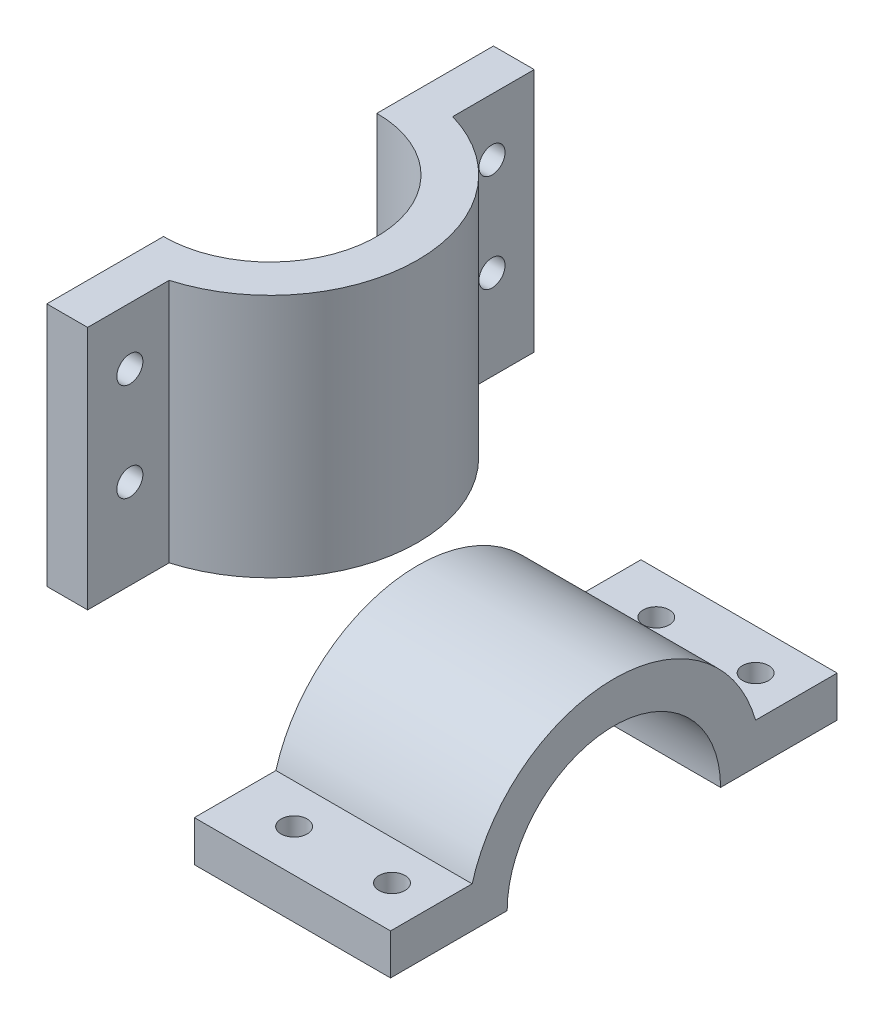
ISO-10303-21;
HEADER;
FILE_DESCRIPTION(('STEP AP214'),'2;1');
FILE_NAME('part.step','',(''),(''),'','','');
FILE_SCHEMA(('AUTOMOTIVE_DESIGN { 1 0 10303 214 1 1 1 1 }'));
ENDSEC;
DATA;
#1=APPLICATION_CONTEXT('core data for automotive mechanical design processes');
#2=APPLICATION_PROTOCOL_DEFINITION('international standard','automotive_design',2000,#1);
#3=PRODUCT_CONTEXT('',#1,'mechanical');
#4=PRODUCT('Part','Part','',(#3));
#5=PRODUCT_RELATED_PRODUCT_CATEGORY('part','',(#4));
#6=PRODUCT_DEFINITION_FORMATION('','',#4);
#7=PRODUCT_DEFINITION_CONTEXT('part definition',#1,'design');
#8=PRODUCT_DEFINITION('design','',#6,#7);
#9=PRODUCT_DEFINITION_SHAPE('','',#8);
#10=(LENGTH_UNIT() NAMED_UNIT(*) SI_UNIT(.MILLI.,.METRE.));
#11=(NAMED_UNIT(*) PLANE_ANGLE_UNIT() SI_UNIT($,.RADIAN.));
#12=(NAMED_UNIT(*) SI_UNIT($,.STERADIAN.) SOLID_ANGLE_UNIT());
#13=UNCERTAINTY_MEASURE_WITH_UNIT(LENGTH_MEASURE(1.E-05),#10,'distance_accuracy_value','');
#14=(GEOMETRIC_REPRESENTATION_CONTEXT(3) GLOBAL_UNCERTAINTY_ASSIGNED_CONTEXT((#13)) GLOBAL_UNIT_ASSIGNED_CONTEXT((#10,
#11,#12)) REPRESENTATION_CONTEXT('',''));
#15=CARTESIAN_POINT('',(0.,0.,0.));
#16=DIRECTION('',(0.,0.,1.));
#17=DIRECTION('',(1.,0.,0.));
#18=AXIS2_PLACEMENT_3D('',#15,#16,#17);
#19=CARTESIAN_POINT('',(-731.419,-202.904651162791,291.131));
#20=DIRECTION('',(0.,-1.,0.));
#21=DIRECTION('',(0.,0.,-1.));
#22=AXIS2_PLACEMENT_3D('',#19,#20,#21);
#23=PLANE('',#22);
#24=CARTESIAN_POINT('',(-712.361893948501,-202.904651162791,295.250449355108));
#25=DIRECTION('',(0.,-1.,0.));
#26=DIRECTION('',(0.,0.,-1.));
#27=AXIS2_PLACEMENT_3D('',#24,#25,#26);
#28=CIRCLE('',#27,1.59999999999991);
#29=CARTESIAN_POINT('',(-712.361893948501,-202.904651162791,293.650449355108));
#30=VERTEX_POINT('',#29);
#31=EDGE_CURVE('E249',#30,#30,#28,.T.);
#32=ORIENTED_EDGE('',*,*,#31,.F.);
#33=EDGE_LOOP('',(#32));
#34=FACE_BOUND('',#33,.T.);
#35=CARTESIAN_POINT('',(-724.361893948501,-202.904651162791,295.250449355108));
#36=DIRECTION('',(0.,-1.,0.));
#37=DIRECTION('',(0.,0.,-1.));
#38=AXIS2_PLACEMENT_3D('',#35,#36,#37);
#39=CIRCLE('',#38,1.60000000000002);
#40=CARTESIAN_POINT('',(-724.361893948501,-202.904651162791,293.650449355108));
#41=VERTEX_POINT('',#40);
#42=EDGE_CURVE('E192',#41,#41,#39,.T.);
#43=ORIENTED_EDGE('',*,*,#42,.F.);
#44=EDGE_LOOP('',(#43));
#45=FACE_BOUND('',#44,.T.);
#46=DIRECTION('',(0.,0.,-1.));
#47=VECTOR('',#46,1.);
#48=CARTESIAN_POINT('',(-707.361893948501,-202.904651162791,291.131));
#49=LINE('',#48,#47);
#50=CARTESIAN_POINT('',(-707.361893948501,-202.904651162791,300.425918997279));
#51=VERTEX_POINT('',#50);
#52=CARTESIAN_POINT('',(-707.361893948501,-202.904651162791,286.131));
#53=VERTEX_POINT('',#52);
#54=EDGE_CURVE('E169',#51,#53,#49,.T.);
#55=ORIENTED_EDGE('',*,*,#54,.F.);
#56=DIRECTION('',(1.,0.,0.));
#57=VECTOR('',#56,1.);
#58=CARTESIAN_POINT('',(-731.419,-202.904651162791,300.425918997279));
#59=LINE('',#58,#57);
#60=CARTESIAN_POINT('',(-731.419,-202.904651162791,300.425918997279));
#61=VERTEX_POINT('',#60);
#62=EDGE_CURVE('E12',#61,#51,#59,.T.);
#63=ORIENTED_EDGE('',*,*,#62,.F.);
#64=DIRECTION('',(0.,0.,-1.));
#65=VECTOR('',#64,1.);
#66=CARTESIAN_POINT('',(-731.419,-202.904651162791,291.131));
#67=LINE('',#66,#65);
#68=CARTESIAN_POINT('',(-731.419,-202.904651162791,286.131));
#69=VERTEX_POINT('',#68);
#70=EDGE_CURVE('E71',#61,#69,#67,.T.);
#71=ORIENTED_EDGE('',*,*,#70,.T.);
#72=DIRECTION('',(1.,0.,0.));
#73=VECTOR('',#72,1.);
#74=CARTESIAN_POINT('',(-731.419,-202.904651162791,286.131));
#75=LINE('',#74,#73);
#76=EDGE_CURVE('E112',#69,#53,#75,.T.);
#77=ORIENTED_EDGE('',*,*,#76,.T.);
#78=EDGE_LOOP('',(#55,#63,#71,#77));
#79=FACE_BOUND('',#78,.T.);
#80=ADVANCED_FACE('F52',(#34,#45,#79),#23,.T.);
#81=CARTESIAN_POINT('',(-731.419,-202.904651162791,300.425918997279));
#82=DIRECTION('',(0.,0.,1.));
#83=DIRECTION('',(1.,0.,0.));
#84=AXIS2_PLACEMENT_3D('',#81,#82,#83);
#85=PLANE('',#84);
#86=DIRECTION('',(0.,-1.,0.));
#87=VECTOR('',#86,1.);
#88=CARTESIAN_POINT('',(-707.361893948501,-202.904651162791,300.425918997279));
#89=LINE('',#88,#87);
#90=CARTESIAN_POINT('',(-707.361893948501,-197.904651162791,300.425918997279));
#91=VERTEX_POINT('',#90);
#92=EDGE_CURVE('E167',#91,#51,#89,.T.);
#93=ORIENTED_EDGE('',*,*,#92,.F.);
#94=DIRECTION('',(1.,0.,0.));
#95=VECTOR('',#94,1.);
#96=CARTESIAN_POINT('',(-731.419,-197.904651162791,300.425918997279));
#97=LINE('',#96,#95);
#98=CARTESIAN_POINT('',(-731.419,-197.904651162791,300.425918997279));
#99=VERTEX_POINT('',#98);
#100=EDGE_CURVE('E62',#99,#91,#97,.T.);
#101=ORIENTED_EDGE('',*,*,#100,.F.);
#102=DIRECTION('',(0.,-1.,0.));
#103=VECTOR('',#102,1.);
#104=CARTESIAN_POINT('',(-731.419,-202.904651162791,300.425918997279));
#105=LINE('',#104,#103);
#106=EDGE_CURVE('E142',#99,#61,#105,.T.);
#107=ORIENTED_EDGE('',*,*,#106,.T.);
#108=ORIENTED_EDGE('',*,*,#62,.T.);
#109=EDGE_LOOP('',(#93,#101,#107,#108));
#110=FACE_BOUND('',#109,.T.);
#111=ADVANCED_FACE('F216',(#110),#85,.T.);
#112=CARTESIAN_POINT('',(-731.419,-197.904651162791,300.425918997279));
#113=DIRECTION('',(0.,1.,0.));
#114=DIRECTION('',(0.,0.,1.));
#115=AXIS2_PLACEMENT_3D('',#112,#113,#114);
#116=PLANE('',#115);
#117=CARTESIAN_POINT('',(-712.361893948501,-197.904651162791,295.250449355108));
#118=DIRECTION('',(0.,1.,0.));
#119=DIRECTION('',(0.,0.,1.));
#120=AXIS2_PLACEMENT_3D('',#117,#118,#119);
#121=CIRCLE('',#120,1.59999999999991);
#122=CARTESIAN_POINT('',(-712.361893948501,-197.904651162791,296.850449355108));
#123=VERTEX_POINT('',#122);
#124=EDGE_CURVE('E56',#123,#123,#121,.T.);
#125=ORIENTED_EDGE('',*,*,#124,.F.);
#126=EDGE_LOOP('',(#125));
#127=FACE_BOUND('',#126,.T.);
#128=CARTESIAN_POINT('',(-724.361893948501,-197.904651162791,295.250449355108));
#129=DIRECTION('',(0.,1.,0.));
#130=DIRECTION('',(0.,0.,1.));
#131=AXIS2_PLACEMENT_3D('',#128,#129,#130);
#132=CIRCLE('',#131,1.60000000000002);
#133=CARTESIAN_POINT('',(-724.361893948501,-197.904651162791,296.850449355108));
#134=VERTEX_POINT('',#133);
#135=EDGE_CURVE('E180',#134,#134,#132,.T.);
#136=ORIENTED_EDGE('',*,*,#135,.F.);
#137=EDGE_LOOP('',(#136));
#138=FACE_BOUND('',#137,.T.);
#139=DIRECTION('',(0.,0.,1.));
#140=VECTOR('',#139,1.);
#141=CARTESIAN_POINT('',(-707.361893948501,-197.904651162791,300.425918997279));
#142=LINE('',#141,#140);
#143=CARTESIAN_POINT('',(-707.361893948501,-197.904651162791,290.425918997279));
#144=VERTEX_POINT('',#143);
#145=EDGE_CURVE('E130',#144,#91,#142,.T.);
#146=ORIENTED_EDGE('',*,*,#145,.F.);
#147=DIRECTION('',(1.,0.,0.));
#148=VECTOR('',#147,1.);
#149=CARTESIAN_POINT('',(-731.419,-197.904651162791,290.425918997279));
#150=LINE('',#149,#148);
#151=CARTESIAN_POINT('',(-731.419,-197.904651162791,290.425918997279));
#152=VERTEX_POINT('',#151);
#153=EDGE_CURVE('E125',#152,#144,#150,.T.);
#154=ORIENTED_EDGE('',*,*,#153,.F.);
#155=DIRECTION('',(0.,0.,1.));
#156=VECTOR('',#155,1.);
#157=CARTESIAN_POINT('',(-731.419,-197.904651162791,300.425918997279));
#158=LINE('',#157,#156);
#159=EDGE_CURVE('E128',#152,#99,#158,.T.);
#160=ORIENTED_EDGE('',*,*,#159,.T.);
#161=ORIENTED_EDGE('',*,*,#100,.T.);
#162=EDGE_LOOP('',(#146,#154,#160,#161));
#163=FACE_BOUND('',#162,.T.);
#164=ADVANCED_FACE('F127',(#127,#138,#163),#116,.T.);
#165=CARTESIAN_POINT('',(-731.419,-202.904651162791,273.05));
#166=DIRECTION('',(1.,0.,0.));
#167=DIRECTION('',(0.,0.,-1.));
#168=AXIS2_PLACEMENT_3D('',#165,#166,#167);
#169=CYLINDRICAL_SURFACE('',#168,18.081);
#170=CARTESIAN_POINT('',(-707.361893948501,-202.904651162791,273.05));
#171=DIRECTION('',(1.,0.,0.));
#172=DIRECTION('',(0.,0.,-1.));
#173=AXIS2_PLACEMENT_3D('',#170,#171,#172);
#174=CIRCLE('',#173,18.081);
#175=CARTESIAN_POINT('',(-707.361893948501,-197.904651162791,255.674081002721));
#176=VERTEX_POINT('',#175);
#177=EDGE_CURVE('E164',#176,#144,#174,.T.);
#178=ORIENTED_EDGE('',*,*,#177,.F.);
#179=DIRECTION('',(1.,0.,0.));
#180=VECTOR('',#179,1.);
#181=CARTESIAN_POINT('',(-731.419,-197.904651162791,255.674081002721));
#182=LINE('',#181,#180);
#183=CARTESIAN_POINT('',(-731.419,-197.904651162791,255.674081002721));
#184=VERTEX_POINT('',#183);
#185=EDGE_CURVE('E135',#184,#176,#182,.T.);
#186=ORIENTED_EDGE('',*,*,#185,.F.);
#187=CARTESIAN_POINT('',(-731.419,-202.904651162791,273.05));
#188=DIRECTION('',(1.,0.,0.));
#189=DIRECTION('',(0.,0.,-1.));
#190=AXIS2_PLACEMENT_3D('',#187,#188,#189);
#191=CIRCLE('',#190,18.081);
#192=EDGE_CURVE('E140',#184,#152,#191,.T.);
#193=ORIENTED_EDGE('',*,*,#192,.T.);
#194=ORIENTED_EDGE('',*,*,#153,.T.);
#195=EDGE_LOOP('',(#178,#186,#193,#194));
#196=FACE_BOUND('',#195,.T.);
#197=ADVANCED_FACE('F144',(#196),#169,.T.);
#198=CARTESIAN_POINT('',(-731.419,-197.904651162791,245.674081002721));
#199=DIRECTION('',(0.,1.,0.));
#200=DIRECTION('',(0.,0.,1.));
#201=AXIS2_PLACEMENT_3D('',#198,#199,#200);
#202=PLANE('',#201);
#203=CARTESIAN_POINT('',(-724.361893948501,-197.904651162791,250.849550644892));
#204=DIRECTION('',(0.,1.,0.));
#205=DIRECTION('',(0.,0.,1.));
#206=AXIS2_PLACEMENT_3D('',#203,#204,#205);
#207=CIRCLE('',#206,1.60000000000002);
#208=CARTESIAN_POINT('',(-724.361893948501,-197.904651162791,252.449550644892));
#209=VERTEX_POINT('',#208);
#210=EDGE_CURVE('E182',#209,#209,#207,.T.);
#211=ORIENTED_EDGE('',*,*,#210,.F.);
#212=EDGE_LOOP('',(#211));
#213=FACE_BOUND('',#212,.T.);
#214=CARTESIAN_POINT('',(-712.361893948501,-197.904651162791,250.674081002721));
#215=DIRECTION('',(0.,1.,0.));
#216=DIRECTION('',(0.,0.,1.));
#217=AXIS2_PLACEMENT_3D('',#214,#215,#216);
#218=CIRCLE('',#217,1.59999999999991);
#219=CARTESIAN_POINT('',(-712.361893948501,-197.904651162791,252.274081002721));
#220=VERTEX_POINT('',#219);
#221=EDGE_CURVE('E187',#220,#220,#218,.T.);
#222=ORIENTED_EDGE('',*,*,#221,.F.);
#223=EDGE_LOOP('',(#222));
#224=FACE_BOUND('',#223,.T.);
#225=DIRECTION('',(0.,0.,1.));
#226=VECTOR('',#225,1.);
#227=CARTESIAN_POINT('',(-707.361893948501,-197.904651162791,245.674081002721));
#228=LINE('',#227,#226);
#229=CARTESIAN_POINT('',(-707.361893948501,-197.904651162791,245.674081002721));
#230=VERTEX_POINT('',#229);
#231=EDGE_CURVE('E161',#230,#176,#228,.T.);
#232=ORIENTED_EDGE('',*,*,#231,.F.);
#233=DIRECTION('',(1.,0.,0.));
#234=VECTOR('',#233,1.);
#235=CARTESIAN_POINT('',(-731.419,-197.904651162791,245.674081002721));
#236=LINE('',#235,#234);
#237=CARTESIAN_POINT('',(-731.419,-197.904651162791,245.674081002721));
#238=VERTEX_POINT('',#237);
#239=EDGE_CURVE('E173',#238,#230,#236,.T.);
#240=ORIENTED_EDGE('',*,*,#239,.F.);
#241=DIRECTION('',(0.,0.,1.));
#242=VECTOR('',#241,1.);
#243=CARTESIAN_POINT('',(-731.419,-197.904651162791,245.674081002721));
#244=LINE('',#243,#242);
#245=EDGE_CURVE('E145',#238,#184,#244,.T.);
#246=ORIENTED_EDGE('',*,*,#245,.T.);
#247=ORIENTED_EDGE('',*,*,#185,.T.);
#248=EDGE_LOOP('',(#232,#240,#246,#247));
#249=FACE_BOUND('',#248,.T.);
#250=ADVANCED_FACE('F209',(#213,#224,#249),#202,.T.);
#251=CARTESIAN_POINT('',(-731.419,-202.904651162791,245.674081002721));
#252=DIRECTION('',(0.,0.,-1.));
#253=DIRECTION('',(-1.,0.,0.));
#254=AXIS2_PLACEMENT_3D('',#251,#252,#253);
#255=PLANE('',#254);
#256=DIRECTION('',(0.,1.,0.));
#257=VECTOR('',#256,1.);
#258=CARTESIAN_POINT('',(-707.361893948501,-202.904651162791,245.674081002721));
#259=LINE('',#258,#257);
#260=CARTESIAN_POINT('',(-707.361893948501,-202.904651162791,245.674081002721));
#261=VERTEX_POINT('',#260);
#262=EDGE_CURVE('E158',#261,#230,#259,.T.);
#263=ORIENTED_EDGE('',*,*,#262,.F.);
#264=DIRECTION('',(1.,0.,0.));
#265=VECTOR('',#264,1.);
#266=CARTESIAN_POINT('',(-731.419,-202.904651162791,245.674081002721));
#267=LINE('',#266,#265);
#268=CARTESIAN_POINT('',(-731.419,-202.904651162791,245.674081002721));
#269=VERTEX_POINT('',#268);
#270=EDGE_CURVE('E175',#269,#261,#267,.T.);
#271=ORIENTED_EDGE('',*,*,#270,.F.);
#272=DIRECTION('',(0.,1.,0.));
#273=VECTOR('',#272,1.);
#274=CARTESIAN_POINT('',(-731.419,-202.904651162791,245.674081002721));
#275=LINE('',#274,#273);
#276=EDGE_CURVE('E147',#269,#238,#275,.T.);
#277=ORIENTED_EDGE('',*,*,#276,.T.);
#278=ORIENTED_EDGE('',*,*,#239,.T.);
#279=EDGE_LOOP('',(#263,#271,#277,#278));
#280=FACE_BOUND('',#279,.T.);
#281=ADVANCED_FACE('F205',(#280),#255,.T.);
#282=CARTESIAN_POINT('',(-731.419,-202.904651162791,254.969));
#283=DIRECTION('',(0.,-1.,0.));
#284=DIRECTION('',(0.,0.,-1.));
#285=AXIS2_PLACEMENT_3D('',#282,#283,#284);
#286=PLANE('',#285);
#287=CARTESIAN_POINT('',(-724.361893948501,-202.904651162791,250.849550644892));
#288=DIRECTION('',(0.,-1.,0.));
#289=DIRECTION('',(0.,0.,-1.));
#290=AXIS2_PLACEMENT_3D('',#287,#288,#289);
#291=CIRCLE('',#290,1.60000000000002);
#292=CARTESIAN_POINT('',(-724.361893948501,-202.904651162791,249.249550644892));
#293=VERTEX_POINT('',#292);
#294=EDGE_CURVE('E244',#293,#293,#291,.T.);
#295=ORIENTED_EDGE('',*,*,#294,.F.);
#296=EDGE_LOOP('',(#295));
#297=FACE_BOUND('',#296,.T.);
#298=CARTESIAN_POINT('',(-712.361893948501,-202.904651162791,250.674081002721));
#299=DIRECTION('',(0.,-1.,0.));
#300=DIRECTION('',(0.,0.,-1.));
#301=AXIS2_PLACEMENT_3D('',#298,#299,#300);
#302=CIRCLE('',#301,1.59999999999991);
#303=CARTESIAN_POINT('',(-712.361893948501,-202.904651162791,249.074081002721));
#304=VERTEX_POINT('',#303);
#305=EDGE_CURVE('E247',#304,#304,#302,.T.);
#306=ORIENTED_EDGE('',*,*,#305,.F.);
#307=EDGE_LOOP('',(#306));
#308=FACE_BOUND('',#307,.T.);
#309=DIRECTION('',(0.,0.,-1.));
#310=VECTOR('',#309,1.);
#311=CARTESIAN_POINT('',(-707.361893948501,-202.904651162791,254.969));
#312=LINE('',#311,#310);
#313=CARTESIAN_POINT('',(-707.361893948501,-202.904651162791,259.969));
#314=VERTEX_POINT('',#313);
#315=EDGE_CURVE('E155',#314,#261,#312,.T.);
#316=ORIENTED_EDGE('',*,*,#315,.F.);
#317=DIRECTION('',(1.,0.,0.));
#318=VECTOR('',#317,1.);
#319=CARTESIAN_POINT('',(-731.419,-202.904651162791,259.969));
#320=LINE('',#319,#318);
#321=CARTESIAN_POINT('',(-731.419,-202.904651162791,259.969));
#322=VERTEX_POINT('',#321);
#323=EDGE_CURVE('E177',#322,#314,#320,.T.);
#324=ORIENTED_EDGE('',*,*,#323,.F.);
#325=DIRECTION('',(0.,0.,-1.));
#326=VECTOR('',#325,1.);
#327=CARTESIAN_POINT('',(-731.419,-202.904651162791,259.969));
#328=LINE('',#327,#326);
#329=EDGE_CURVE('E199',#322,#269,#328,.T.);
#330=ORIENTED_EDGE('',*,*,#329,.T.);
#331=ORIENTED_EDGE('',*,*,#270,.T.);
#332=EDGE_LOOP('',(#316,#324,#330,#331));
#333=FACE_BOUND('',#332,.T.);
#334=ADVANCED_FACE('F213',(#297,#308,#333),#286,.T.);
#335=CARTESIAN_POINT('',(-731.419,-202.904651162791,273.05));
#336=DIRECTION('',(1.,0.,0.));
#337=DIRECTION('',(0.,0.,-1.));
#338=AXIS2_PLACEMENT_3D('',#335,#336,#337);
#339=CYLINDRICAL_SURFACE('',#338,13.081);
#340=CARTESIAN_POINT('',(-707.361893948501,-202.904651162791,273.05));
#341=DIRECTION('',(-1.,0.,0.));
#342=DIRECTION('',(0.,0.,-1.));
#343=AXIS2_PLACEMENT_3D('',#340,#341,#342);
#344=CIRCLE('',#343,13.081);
#345=EDGE_CURVE('E152',#53,#314,#344,.T.);
#346=ORIENTED_EDGE('',*,*,#345,.F.);
#347=ORIENTED_EDGE('',*,*,#76,.F.);
#348=CARTESIAN_POINT('',(-731.419,-202.904651162791,273.05));
#349=DIRECTION('',(-1.,0.,0.));
#350=DIRECTION('',(0.,0.,-1.));
#351=AXIS2_PLACEMENT_3D('',#348,#349,#350);
#352=CIRCLE('',#351,13.081);
#353=EDGE_CURVE('E197',#69,#322,#352,.T.);
#354=ORIENTED_EDGE('',*,*,#353,.T.);
#355=ORIENTED_EDGE('',*,*,#323,.T.);
#356=EDGE_LOOP('',(#346,#347,#354,#355));
#357=FACE_BOUND('',#356,.T.);
#358=ADVANCED_FACE('F54',(#357),#339,.F.);
#359=CARTESIAN_POINT('',(-731.419,-202.904651162791,273.05));
#360=DIRECTION('',(1.,0.,0.));
#361=DIRECTION('',(0.,0.,-1.));
#362=AXIS2_PLACEMENT_3D('',#359,#360,#361);
#363=PLANE('',#362);
#364=ORIENTED_EDGE('',*,*,#70,.F.);
#365=ORIENTED_EDGE('',*,*,#106,.F.);
#366=ORIENTED_EDGE('',*,*,#159,.F.);
#367=ORIENTED_EDGE('',*,*,#192,.F.);
#368=ORIENTED_EDGE('',*,*,#245,.F.);
#369=ORIENTED_EDGE('',*,*,#276,.F.);
#370=ORIENTED_EDGE('',*,*,#329,.F.);
#371=ORIENTED_EDGE('',*,*,#353,.F.);
#372=EDGE_LOOP('',(#364,#365,#366,#367,#368,#369,#370,#371));
#373=FACE_BOUND('',#372,.T.);
#374=ADVANCED_FACE('F138',(#373),#363,.F.);
#375=CARTESIAN_POINT('',(-707.361893948501,-202.904651162791,273.05));
#376=DIRECTION('',(1.,0.,0.));
#377=DIRECTION('',(0.,0.,-1.));
#378=AXIS2_PLACEMENT_3D('',#375,#376,#377);
#379=PLANE('',#378);
#380=ORIENTED_EDGE('',*,*,#54,.T.);
#381=ORIENTED_EDGE('',*,*,#345,.T.);
#382=ORIENTED_EDGE('',*,*,#315,.T.);
#383=ORIENTED_EDGE('',*,*,#262,.T.);
#384=ORIENTED_EDGE('',*,*,#231,.T.);
#385=ORIENTED_EDGE('',*,*,#177,.T.);
#386=ORIENTED_EDGE('',*,*,#145,.T.);
#387=ORIENTED_EDGE('',*,*,#92,.T.);
#388=EDGE_LOOP('',(#380,#381,#382,#383,#384,#385,#386,#387));
#389=FACE_BOUND('',#388,.T.);
#390=ADVANCED_FACE('F211',(#389),#379,.T.);
#391=CARTESIAN_POINT('',(-712.361893948501,-152.4,250.674081002721));
#392=DIRECTION('',(0.,-1.,0.));
#393=DIRECTION('',(0.,0.,-1.));
#394=AXIS2_PLACEMENT_3D('',#391,#392,#393);
#395=CYLINDRICAL_SURFACE('',#394,1.59999999999991);
#396=ORIENTED_EDGE('',*,*,#221,.T.);
#397=EDGE_LOOP('',(#396));
#398=FACE_BOUND('',#397,.T.);
#399=ORIENTED_EDGE('',*,*,#305,.T.);
#400=EDGE_LOOP('',(#399));
#401=FACE_BOUND('',#400,.T.);
#402=ADVANCED_FACE('F269',(#398,#401),#395,.F.);
#403=CARTESIAN_POINT('',(-724.361893948501,-152.4,250.849550644892));
#404=DIRECTION('',(0.,-1.,0.));
#405=DIRECTION('',(0.,0.,-1.));
#406=AXIS2_PLACEMENT_3D('',#403,#404,#405);
#407=CYLINDRICAL_SURFACE('',#406,1.60000000000002);
#408=ORIENTED_EDGE('',*,*,#210,.T.);
#409=EDGE_LOOP('',(#408));
#410=FACE_BOUND('',#409,.T.);
#411=ORIENTED_EDGE('',*,*,#294,.T.);
#412=EDGE_LOOP('',(#411));
#413=FACE_BOUND('',#412,.T.);
#414=ADVANCED_FACE('F261',(#410,#413),#407,.F.);
#415=CARTESIAN_POINT('',(-724.361893948501,-152.4,295.250449355108));
#416=DIRECTION('',(0.,-1.,0.));
#417=DIRECTION('',(0.,0.,-1.));
#418=AXIS2_PLACEMENT_3D('',#415,#416,#417);
#419=CYLINDRICAL_SURFACE('',#418,1.60000000000002);
#420=ORIENTED_EDGE('',*,*,#135,.T.);
#421=EDGE_LOOP('',(#420));
#422=FACE_BOUND('',#421,.T.);
#423=ORIENTED_EDGE('',*,*,#42,.T.);
#424=EDGE_LOOP('',(#423));
#425=FACE_BOUND('',#424,.T.);
#426=ADVANCED_FACE('F257',(#422,#425),#419,.F.);
#427=CARTESIAN_POINT('',(-712.361893948501,-152.4,295.250449355108));
#428=DIRECTION('',(0.,-1.,0.));
#429=DIRECTION('',(0.,0.,-1.));
#430=AXIS2_PLACEMENT_3D('',#427,#428,#429);
#431=CYLINDRICAL_SURFACE('',#430,1.59999999999991);
#432=ORIENTED_EDGE('',*,*,#124,.T.);
#433=EDGE_LOOP('',(#432));
#434=FACE_BOUND('',#433,.T.);
#435=ORIENTED_EDGE('',*,*,#31,.T.);
#436=EDGE_LOOP('',(#435));
#437=FACE_BOUND('',#436,.T.);
#438=ADVANCED_FACE('F260',(#434,#437),#431,.F.);
#439=CLOSED_SHELL('',(#80,#111,#164,#197,#250,#281,#334,#358,#374,#390,#402,#414,#426,#438));
#440=MANIFOLD_SOLID_BREP('B2',#439);
#441=CARTESIAN_POINT('',(-749.5,-182.4,245.674081002721));
#442=DIRECTION('',(0.,0.,-1.));
#443=DIRECTION('',(-1.,0.,0.));
#444=AXIS2_PLACEMENT_3D('',#441,#442,#443);
#445=PLANE('',#444);
#446=DIRECTION('',(-1.,0.,0.));
#447=VECTOR('',#446,1.);
#448=CARTESIAN_POINT('',(-749.5,-152.4,245.674081002721));
#449=LINE('',#448,#447);
#450=CARTESIAN_POINT('',(-744.5,-152.4,245.674081002721));
#451=VERTEX_POINT('',#450);
#452=CARTESIAN_POINT('',(-749.5,-152.4,245.674081002721));
#453=VERTEX_POINT('',#452);
#454=EDGE_CURVE('E481',#451,#453,#449,.T.);
#455=ORIENTED_EDGE('',*,*,#454,.F.);
#456=DIRECTION('',(0.,1.,0.));
#457=VECTOR('',#456,1.);
#458=CARTESIAN_POINT('',(-744.5,-182.4,245.674081002721));
#459=LINE('',#458,#457);
#460=CARTESIAN_POINT('',(-744.5,-182.4,245.674081002721));
#461=VERTEX_POINT('',#460);
#462=EDGE_CURVE('E379',#461,#451,#459,.T.);
#463=ORIENTED_EDGE('',*,*,#462,.F.);
#464=DIRECTION('',(-1.,0.,0.));
#465=VECTOR('',#464,1.);
#466=CARTESIAN_POINT('',(-749.5,-182.4,245.674081002721));
#467=LINE('',#466,#465);
#468=CARTESIAN_POINT('',(-749.5,-182.4,245.674081002721));
#469=VERTEX_POINT('',#468);
#470=EDGE_CURVE('E454',#461,#469,#467,.T.);
#471=ORIENTED_EDGE('',*,*,#470,.T.);
#472=DIRECTION('',(0.,1.,0.));
#473=VECTOR('',#472,1.);
#474=CARTESIAN_POINT('',(-749.5,-182.4,245.674081002721));
#475=LINE('',#474,#473);
#476=EDGE_CURVE('E50',#469,#453,#475,.T.);
#477=ORIENTED_EDGE('',*,*,#476,.T.);
#478=EDGE_LOOP('',(#455,#463,#471,#477));
#479=FACE_BOUND('',#478,.T.);
#480=ADVANCED_FACE('F369',(#479),#445,.T.);
#481=CARTESIAN_POINT('',(-744.5,-182.4,245.674081002721));
#482=DIRECTION('',(1.,0.,0.));
#483=DIRECTION('',(0.,0.,-1.));
#484=AXIS2_PLACEMENT_3D('',#481,#482,#483);
#485=PLANE('',#484);
#486=CARTESIAN_POINT('',(-744.5,-159.4,250.849550644892));
#487=DIRECTION('',(1.,0.,0.));
#488=DIRECTION('',(0.,0.,-1.));
#489=AXIS2_PLACEMENT_3D('',#486,#487,#488);
#490=CIRCLE('',#489,1.59999999999991);
#491=CARTESIAN_POINT('',(-744.5,-159.4,249.249550644892));
#492=VERTEX_POINT('',#491);
#493=EDGE_CURVE('E552',#492,#492,#490,.T.);
#494=ORIENTED_EDGE('',*,*,#493,.F.);
#495=EDGE_LOOP('',(#494));
#496=FACE_BOUND('',#495,.T.);
#497=CARTESIAN_POINT('',(-744.5,-171.4,250.849550644892));
#498=DIRECTION('',(1.,0.,0.));
#499=DIRECTION('',(0.,0.,-1.));
#500=AXIS2_PLACEMENT_3D('',#497,#498,#499);
#501=CIRCLE('',#500,1.59999999999991);
#502=CARTESIAN_POINT('',(-744.5,-171.4,249.249550644892));
#503=VERTEX_POINT('',#502);
#504=EDGE_CURVE('E549',#503,#503,#501,.T.);
#505=ORIENTED_EDGE('',*,*,#504,.F.);
#506=EDGE_LOOP('',(#505));
#507=FACE_BOUND('',#506,.T.);
#508=DIRECTION('',(0.,0.,-1.));
#509=VECTOR('',#508,1.);
#510=CARTESIAN_POINT('',(-744.5,-152.4,245.674081002721));
#511=LINE('',#510,#509);
#512=CARTESIAN_POINT('',(-744.5,-152.4,255.674081002721));
#513=VERTEX_POINT('',#512);
#514=EDGE_CURVE('E440',#513,#451,#511,.T.);
#515=ORIENTED_EDGE('',*,*,#514,.F.);
#516=DIRECTION('',(0.,1.,0.));
#517=VECTOR('',#516,1.);
#518=CARTESIAN_POINT('',(-744.5,-182.4,255.674081002721));
#519=LINE('',#518,#517);
#520=CARTESIAN_POINT('',(-744.5,-182.4,255.674081002721));
#521=VERTEX_POINT('',#520);
#522=EDGE_CURVE('E435',#521,#513,#519,.T.);
#523=ORIENTED_EDGE('',*,*,#522,.F.);
#524=DIRECTION('',(0.,0.,-1.));
#525=VECTOR('',#524,1.);
#526=CARTESIAN_POINT('',(-744.5,-182.4,245.674081002721));
#527=LINE('',#526,#525);
#528=EDGE_CURVE('E438',#521,#461,#527,.T.);
#529=ORIENTED_EDGE('',*,*,#528,.T.);
#530=ORIENTED_EDGE('',*,*,#462,.T.);
#531=EDGE_LOOP('',(#515,#523,#529,#530));
#532=FACE_BOUND('',#531,.T.);
#533=ADVANCED_FACE('F437',(#496,#507,#532),#485,.T.);
#534=CARTESIAN_POINT('',(-749.5,-182.4,273.05));
#535=DIRECTION('',(0.,1.,0.));
#536=DIRECTION('',(0.,0.,1.));
#537=AXIS2_PLACEMENT_3D('',#534,#535,#536);
#538=CYLINDRICAL_SURFACE('',#537,18.081);
#539=CARTESIAN_POINT('',(-749.5,-152.4,273.05));
#540=DIRECTION('',(0.,1.,0.));
#541=DIRECTION('',(0.,0.,1.));
#542=AXIS2_PLACEMENT_3D('',#539,#540,#541);
#543=CIRCLE('',#542,18.081);
#544=CARTESIAN_POINT('',(-744.5,-152.4,290.425918997279));
#545=VERTEX_POINT('',#544);
#546=EDGE_CURVE('E478',#545,#513,#543,.T.);
#547=ORIENTED_EDGE('',*,*,#546,.F.);
#548=DIRECTION('',(0.,1.,0.));
#549=VECTOR('',#548,1.);
#550=CARTESIAN_POINT('',(-744.5,-182.4,290.425918997279));
#551=LINE('',#550,#549);
#552=CARTESIAN_POINT('',(-744.5,-182.4,290.425918997279));
#553=VERTEX_POINT('',#552);
#554=EDGE_CURVE('E445',#553,#545,#551,.T.);
#555=ORIENTED_EDGE('',*,*,#554,.F.);
#556=CARTESIAN_POINT('',(-749.5,-182.4,273.05));
#557=DIRECTION('',(0.,1.,0.));
#558=DIRECTION('',(0.,0.,1.));
#559=AXIS2_PLACEMENT_3D('',#556,#557,#558);
#560=CIRCLE('',#559,18.081);
#561=EDGE_CURVE('E451',#553,#521,#560,.T.);
#562=ORIENTED_EDGE('',*,*,#561,.T.);
#563=ORIENTED_EDGE('',*,*,#522,.T.);
#564=EDGE_LOOP('',(#547,#555,#562,#563));
#565=FACE_BOUND('',#564,.T.);
#566=ADVANCED_FACE('F456',(#565),#538,.T.);
#567=CARTESIAN_POINT('',(-744.5,-182.4,300.425918997279));
#568=DIRECTION('',(1.,0.,0.));
#569=DIRECTION('',(0.,0.,-1.));
#570=AXIS2_PLACEMENT_3D('',#567,#568,#569);
#571=PLANE('',#570);
#572=CARTESIAN_POINT('',(-744.5,-171.4,295.250449355108));
#573=DIRECTION('',(1.,0.,0.));
#574=DIRECTION('',(0.,0.,-1.));
#575=AXIS2_PLACEMENT_3D('',#572,#573,#574);
#576=CIRCLE('',#575,1.59999999999996);
#577=CARTESIAN_POINT('',(-744.5,-171.4,293.650449355108));
#578=VERTEX_POINT('',#577);
#579=EDGE_CURVE('E466',#578,#578,#576,.T.);
#580=ORIENTED_EDGE('',*,*,#579,.F.);
#581=EDGE_LOOP('',(#580));
#582=FACE_BOUND('',#581,.T.);
#583=CARTESIAN_POINT('',(-744.5,-159.4,295.250449355108));
#584=DIRECTION('',(1.,0.,0.));
#585=DIRECTION('',(0.,0.,-1.));
#586=AXIS2_PLACEMENT_3D('',#583,#584,#585);
#587=CIRCLE('',#586,1.59999999999996);
#588=CARTESIAN_POINT('',(-744.5,-159.4,293.650449355108));
#589=VERTEX_POINT('',#588);
#590=EDGE_CURVE('E555',#589,#589,#587,.T.);
#591=ORIENTED_EDGE('',*,*,#590,.F.);
#592=EDGE_LOOP('',(#591));
#593=FACE_BOUND('',#592,.T.);
#594=DIRECTION('',(0.,0.,-1.));
#595=VECTOR('',#594,1.);
#596=CARTESIAN_POINT('',(-744.5,-152.4,300.425918997279));
#597=LINE('',#596,#595);
#598=CARTESIAN_POINT('',(-744.5,-152.4,300.425918997279));
#599=VERTEX_POINT('',#598);
#600=EDGE_CURVE('E475',#599,#545,#597,.T.);
#601=ORIENTED_EDGE('',*,*,#600,.F.);
#602=DIRECTION('',(0.,1.,0.));
#603=VECTOR('',#602,1.);
#604=CARTESIAN_POINT('',(-744.5,-182.4,300.425918997279));
#605=LINE('',#604,#603);
#606=CARTESIAN_POINT('',(-744.5,-182.4,300.425918997279));
#607=VERTEX_POINT('',#606);
#608=EDGE_CURVE('E486',#607,#599,#605,.T.);
#609=ORIENTED_EDGE('',*,*,#608,.F.);
#610=DIRECTION('',(0.,0.,-1.));
#611=VECTOR('',#610,1.);
#612=CARTESIAN_POINT('',(-744.5,-182.4,300.425918997279));
#613=LINE('',#612,#611);
#614=EDGE_CURVE('E457',#607,#553,#613,.T.);
#615=ORIENTED_EDGE('',*,*,#614,.T.);
#616=ORIENTED_EDGE('',*,*,#554,.T.);
#617=EDGE_LOOP('',(#601,#609,#615,#616));
#618=FACE_BOUND('',#617,.T.);
#619=ADVANCED_FACE('F512',(#582,#593,#618),#571,.T.);
#620=CARTESIAN_POINT('',(-749.5,-182.4,300.425918997279));
#621=DIRECTION('',(0.,0.,1.));
#622=DIRECTION('',(1.,0.,0.));
#623=AXIS2_PLACEMENT_3D('',#620,#621,#622);
#624=PLANE('',#623);
#625=DIRECTION('',(1.,0.,0.));
#626=VECTOR('',#625,1.);
#627=CARTESIAN_POINT('',(-749.5,-152.4,300.425918997279));
#628=LINE('',#627,#626);
#629=CARTESIAN_POINT('',(-749.5,-152.4,300.425918997279));
#630=VERTEX_POINT('',#629);
#631=EDGE_CURVE('E472',#630,#599,#628,.T.);
#632=ORIENTED_EDGE('',*,*,#631,.F.);
#633=DIRECTION('',(0.,1.,0.));
#634=VECTOR('',#633,1.);
#635=CARTESIAN_POINT('',(-749.5,-182.4,300.425918997279));
#636=LINE('',#635,#634);
#637=CARTESIAN_POINT('',(-749.5,-182.4,300.425918997279));
#638=VERTEX_POINT('',#637);
#639=EDGE_CURVE('E488',#638,#630,#636,.T.);
#640=ORIENTED_EDGE('',*,*,#639,.F.);
#641=DIRECTION('',(1.,0.,0.));
#642=VECTOR('',#641,1.);
#643=CARTESIAN_POINT('',(-749.5,-182.4,300.425918997279));
#644=LINE('',#643,#642);
#645=EDGE_CURVE('E459',#638,#607,#644,.T.);
#646=ORIENTED_EDGE('',*,*,#645,.T.);
#647=ORIENTED_EDGE('',*,*,#608,.T.);
#648=EDGE_LOOP('',(#632,#640,#646,#647));
#649=FACE_BOUND('',#648,.T.);
#650=ADVANCED_FACE('F515',(#649),#624,.T.);
#651=CARTESIAN_POINT('',(-749.5,-182.4,290.074979712937));
#652=DIRECTION('',(-1.,0.,0.));
#653=DIRECTION('',(0.,0.,1.));
#654=AXIS2_PLACEMENT_3D('',#651,#652,#653);
#655=PLANE('',#654);
#656=CARTESIAN_POINT('',(-749.5,-171.4,295.250449355108));
#657=DIRECTION('',(-1.,0.,0.));
#658=DIRECTION('',(0.,0.,1.));
#659=AXIS2_PLACEMENT_3D('',#656,#657,#658);
#660=CIRCLE('',#659,1.59999999999996);
#661=CARTESIAN_POINT('',(-749.5,-171.4,296.850449355108));
#662=VERTEX_POINT('',#661);
#663=EDGE_CURVE('E540',#662,#662,#660,.T.);
#664=ORIENTED_EDGE('',*,*,#663,.F.);
#665=EDGE_LOOP('',(#664));
#666=FACE_BOUND('',#665,.T.);
#667=CARTESIAN_POINT('',(-749.5,-159.4,295.250449355108));
#668=DIRECTION('',(-1.,0.,0.));
#669=DIRECTION('',(0.,0.,1.));
#670=AXIS2_PLACEMENT_3D('',#667,#668,#669);
#671=CIRCLE('',#670,1.59999999999996);
#672=CARTESIAN_POINT('',(-749.5,-159.4,296.850449355108));
#673=VERTEX_POINT('',#672);
#674=EDGE_CURVE('E543',#673,#673,#671,.T.);
#675=ORIENTED_EDGE('',*,*,#674,.F.);
#676=EDGE_LOOP('',(#675));
#677=FACE_BOUND('',#676,.T.);
#678=DIRECTION('',(0.,0.,1.));
#679=VECTOR('',#678,1.);
#680=CARTESIAN_POINT('',(-749.5,-152.4,290.074979712937));
#681=LINE('',#680,#679);
#682=CARTESIAN_POINT('',(-749.5,-152.4,286.131));
#683=VERTEX_POINT('',#682);
#684=EDGE_CURVE('E469',#683,#630,#681,.T.);
#685=ORIENTED_EDGE('',*,*,#684,.F.);
#686=DIRECTION('',(0.,1.,0.));
#687=VECTOR('',#686,1.);
#688=CARTESIAN_POINT('',(-749.5,-182.4,286.131));
#689=LINE('',#688,#687);
#690=CARTESIAN_POINT('',(-749.5,-182.4,286.131));
#691=VERTEX_POINT('',#690);
#692=EDGE_CURVE('E489',#691,#683,#689,.T.);
#693=ORIENTED_EDGE('',*,*,#692,.F.);
#694=DIRECTION('',(0.,0.,1.));
#695=VECTOR('',#694,1.);
#696=CARTESIAN_POINT('',(-749.5,-182.4,290.074979712937));
#697=LINE('',#696,#695);
#698=EDGE_CURVE('E563',#691,#638,#697,.T.);
#699=ORIENTED_EDGE('',*,*,#698,.T.);
#700=ORIENTED_EDGE('',*,*,#639,.T.);
#701=EDGE_LOOP('',(#685,#693,#699,#700));
#702=FACE_BOUND('',#701,.T.);
#703=ADVANCED_FACE('F519',(#666,#677,#702),#655,.T.);
#704=CARTESIAN_POINT('',(-749.5,-182.4,273.05));
#705=DIRECTION('',(0.,1.,0.));
#706=DIRECTION('',(0.,0.,1.));
#707=AXIS2_PLACEMENT_3D('',#704,#705,#706);
#708=CYLINDRICAL_SURFACE('',#707,13.081);
#709=CARTESIAN_POINT('',(-749.5,-152.4,273.05));
#710=DIRECTION('',(0.,-1.,0.));
#711=DIRECTION('',(0.,0.,1.));
#712=AXIS2_PLACEMENT_3D('',#709,#710,#711);
#713=CIRCLE('',#712,13.081);
#714=CARTESIAN_POINT('',(-749.5,-152.4,259.969));
#715=VERTEX_POINT('',#714);
#716=EDGE_CURVE('E465',#715,#683,#713,.T.);
#717=ORIENTED_EDGE('',*,*,#716,.F.);
#718=DIRECTION('',(0.,1.,0.));
#719=VECTOR('',#718,1.);
#720=CARTESIAN_POINT('',(-749.5,-182.4,259.969));
#721=LINE('',#720,#719);
#722=CARTESIAN_POINT('',(-749.5,-182.4,259.969));
#723=VERTEX_POINT('',#722);
#724=EDGE_CURVE('E373',#723,#715,#721,.T.);
#725=ORIENTED_EDGE('',*,*,#724,.F.);
#726=CARTESIAN_POINT('',(-749.5,-182.4,273.05));
#727=DIRECTION('',(0.,-1.,0.));
#728=DIRECTION('',(0.,0.,1.));
#729=AXIS2_PLACEMENT_3D('',#726,#727,#728);
#730=CIRCLE('',#729,13.081);
#731=EDGE_CURVE('E561',#723,#691,#730,.T.);
#732=ORIENTED_EDGE('',*,*,#731,.T.);
#733=ORIENTED_EDGE('',*,*,#692,.T.);
#734=EDGE_LOOP('',(#717,#725,#732,#733));
#735=FACE_BOUND('',#734,.T.);
#736=ADVANCED_FACE('F495',(#735),#708,.F.);
#737=CARTESIAN_POINT('',(-749.5,-182.4,256.025020287063));
#738=DIRECTION('',(-1.,0.,0.));
#739=DIRECTION('',(0.,0.,1.));
#740=AXIS2_PLACEMENT_3D('',#737,#738,#739);
#741=PLANE('',#740);
#742=CARTESIAN_POINT('',(-749.5,-159.4,250.849550644892));
#743=DIRECTION('',(-1.,0.,0.));
#744=DIRECTION('',(0.,0.,1.));
#745=AXIS2_PLACEMENT_3D('',#742,#743,#744);
#746=CIRCLE('',#745,1.59999999999991);
#747=CARTESIAN_POINT('',(-749.5,-159.4,252.449550644892));
#748=VERTEX_POINT('',#747);
#749=EDGE_CURVE('E535',#748,#748,#746,.T.);
#750=ORIENTED_EDGE('',*,*,#749,.F.);
#751=EDGE_LOOP('',(#750));
#752=FACE_BOUND('',#751,.T.);
#753=CARTESIAN_POINT('',(-749.5,-171.4,250.849550644892));
#754=DIRECTION('',(-1.,0.,0.));
#755=DIRECTION('',(0.,0.,1.));
#756=AXIS2_PLACEMENT_3D('',#753,#754,#755);
#757=CIRCLE('',#756,1.59999999999991);
#758=CARTESIAN_POINT('',(-749.5,-171.4,252.449550644892));
#759=VERTEX_POINT('',#758);
#760=EDGE_CURVE('E538',#759,#759,#757,.T.);
#761=ORIENTED_EDGE('',*,*,#760,.F.);
#762=EDGE_LOOP('',(#761));
#763=FACE_BOUND('',#762,.T.);
#764=DIRECTION('',(0.,0.,1.));
#765=VECTOR('',#764,1.);
#766=CARTESIAN_POINT('',(-749.5,-152.4,256.025020287063));
#767=LINE('',#766,#765);
#768=EDGE_CURVE('E418',#453,#715,#767,.T.);
#769=ORIENTED_EDGE('',*,*,#768,.F.);
#770=ORIENTED_EDGE('',*,*,#476,.F.);
#771=DIRECTION('',(0.,0.,1.));
#772=VECTOR('',#771,1.);
#773=CARTESIAN_POINT('',(-749.5,-182.4,256.025020287063));
#774=LINE('',#773,#772);
#775=EDGE_CURVE('E421',#469,#723,#774,.T.);
#776=ORIENTED_EDGE('',*,*,#775,.T.);
#777=ORIENTED_EDGE('',*,*,#724,.T.);
#778=EDGE_LOOP('',(#769,#770,#776,#777));
#779=FACE_BOUND('',#778,.T.);
#780=ADVANCED_FACE('F371',(#752,#763,#779),#741,.T.);
#781=CARTESIAN_POINT('',(-749.5,-182.4,273.05));
#782=DIRECTION('',(0.,1.,0.));
#783=DIRECTION('',(0.,0.,1.));
#784=AXIS2_PLACEMENT_3D('',#781,#782,#783);
#785=PLANE('',#784);
#786=ORIENTED_EDGE('',*,*,#775,.F.);
#787=ORIENTED_EDGE('',*,*,#470,.F.);
#788=ORIENTED_EDGE('',*,*,#528,.F.);
#789=ORIENTED_EDGE('',*,*,#561,.F.);
#790=ORIENTED_EDGE('',*,*,#614,.F.);
#791=ORIENTED_EDGE('',*,*,#645,.F.);
#792=ORIENTED_EDGE('',*,*,#698,.F.);
#793=ORIENTED_EDGE('',*,*,#731,.F.);
#794=EDGE_LOOP('',(#786,#787,#788,#789,#790,#791,#792,#793));
#795=FACE_BOUND('',#794,.T.);
#796=ADVANCED_FACE('F449',(#795),#785,.F.);
#797=CARTESIAN_POINT('',(-749.5,-152.4,273.05));
#798=DIRECTION('',(0.,1.,0.));
#799=DIRECTION('',(0.,0.,1.));
#800=AXIS2_PLACEMENT_3D('',#797,#798,#799);
#801=PLANE('',#800);
#802=ORIENTED_EDGE('',*,*,#454,.T.);
#803=ORIENTED_EDGE('',*,*,#768,.T.);
#804=ORIENTED_EDGE('',*,*,#716,.T.);
#805=ORIENTED_EDGE('',*,*,#684,.T.);
#806=ORIENTED_EDGE('',*,*,#631,.T.);
#807=ORIENTED_EDGE('',*,*,#600,.T.);
#808=ORIENTED_EDGE('',*,*,#546,.T.);
#809=ORIENTED_EDGE('',*,*,#514,.T.);
#810=EDGE_LOOP('',(#802,#803,#804,#805,#806,#807,#808,#809));
#811=FACE_BOUND('',#810,.T.);
#812=ADVANCED_FACE('F497',(#811),#801,.T.);
#813=CARTESIAN_POINT('',(-707.361893948501,-171.4,250.849550644892));
#814=DIRECTION('',(-1.,0.,0.));
#815=DIRECTION('',(0.,0.,1.));
#816=AXIS2_PLACEMENT_3D('',#813,#814,#815);
#817=CYLINDRICAL_SURFACE('',#816,1.59999999999991);
#818=ORIENTED_EDGE('',*,*,#504,.T.);
#819=EDGE_LOOP('',(#818));
#820=FACE_BOUND('',#819,.T.);
#821=ORIENTED_EDGE('',*,*,#760,.T.);
#822=EDGE_LOOP('',(#821));
#823=FACE_BOUND('',#822,.T.);
#824=ADVANCED_FACE('F591',(#820,#823),#817,.F.);
#825=CARTESIAN_POINT('',(-707.361893948501,-159.4,250.849550644892));
#826=DIRECTION('',(-1.,0.,0.));
#827=DIRECTION('',(0.,0.,1.));
#828=AXIS2_PLACEMENT_3D('',#825,#826,#827);
#829=CYLINDRICAL_SURFACE('',#828,1.59999999999991);
#830=ORIENTED_EDGE('',*,*,#493,.T.);
#831=EDGE_LOOP('',(#830));
#832=FACE_BOUND('',#831,.T.);
#833=ORIENTED_EDGE('',*,*,#749,.T.);
#834=EDGE_LOOP('',(#833));
#835=FACE_BOUND('',#834,.T.);
#836=ADVANCED_FACE('F582',(#832,#835),#829,.F.);
#837=CARTESIAN_POINT('',(-707.361893948501,-159.4,295.250449355108));
#838=DIRECTION('',(-1.,0.,0.));
#839=DIRECTION('',(0.,0.,1.));
#840=AXIS2_PLACEMENT_3D('',#837,#838,#839);
#841=CYLINDRICAL_SURFACE('',#840,1.59999999999996);
#842=ORIENTED_EDGE('',*,*,#590,.T.);
#843=EDGE_LOOP('',(#842));
#844=FACE_BOUND('',#843,.T.);
#845=ORIENTED_EDGE('',*,*,#674,.T.);
#846=EDGE_LOOP('',(#845));
#847=FACE_BOUND('',#846,.T.);
#848=ADVANCED_FACE('F579',(#844,#847),#841,.F.);
#849=CARTESIAN_POINT('',(-707.361893948501,-171.4,295.250449355108));
#850=DIRECTION('',(-1.,0.,0.));
#851=DIRECTION('',(0.,0.,1.));
#852=AXIS2_PLACEMENT_3D('',#849,#850,#851);
#853=CYLINDRICAL_SURFACE('',#852,1.59999999999996);
#854=ORIENTED_EDGE('',*,*,#579,.T.);
#855=EDGE_LOOP('',(#854));
#856=FACE_BOUND('',#855,.T.);
#857=ORIENTED_EDGE('',*,*,#663,.T.);
#858=EDGE_LOOP('',(#857));
#859=FACE_BOUND('',#858,.T.);
#860=ADVANCED_FACE('F574',(#856,#859),#853,.F.);
#861=CLOSED_SHELL('',(#480,#533,#566,#619,#650,#703,#736,#780,#796,#812,#824,#836,#848,#860));
#862=MANIFOLD_SOLID_BREP('B6',#861);
#863=ADVANCED_BREP_SHAPE_REPRESENTATION('',(#18,#440,#862),#14);
#864=SHAPE_DEFINITION_REPRESENTATION(#9,#863);
ENDSEC;
END-ISO-10303-21;
